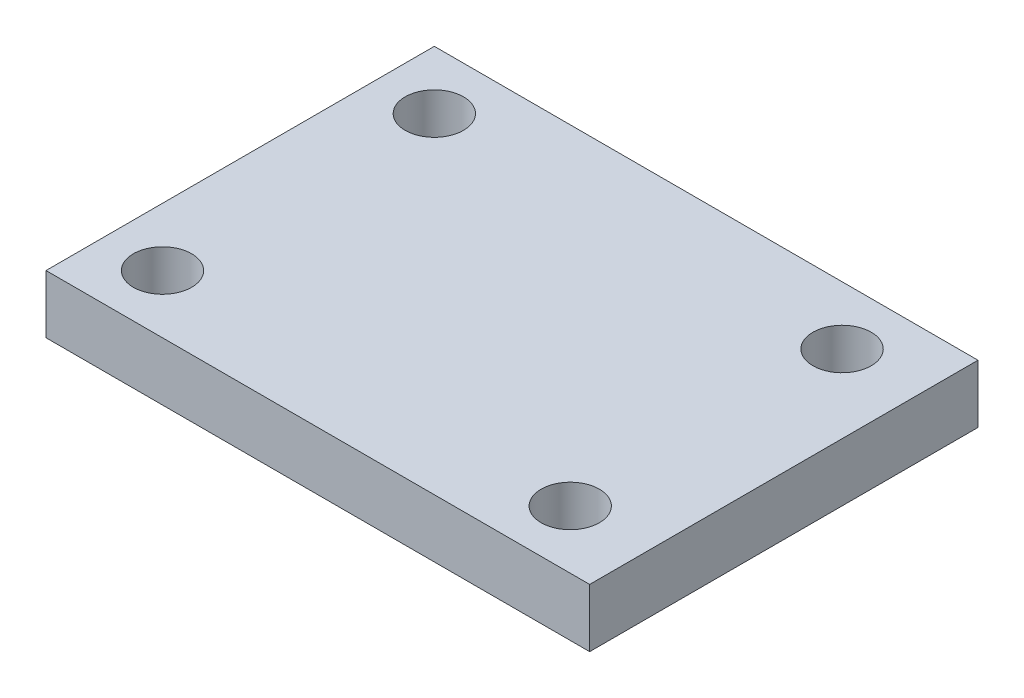
ISO-10303-21;
HEADER;
FILE_DESCRIPTION(('STEP AP214'),'2;1');
FILE_NAME('part.step','',(''),(''),'','','');
FILE_SCHEMA(('AUTOMOTIVE_DESIGN { 1 0 10303 214 1 1 1 1 }'));
ENDSEC;
DATA;
#1=APPLICATION_CONTEXT('core data for automotive mechanical design processes');
#2=APPLICATION_PROTOCOL_DEFINITION('international standard','automotive_design',2000,#1);
#3=PRODUCT_CONTEXT('',#1,'mechanical');
#4=PRODUCT('Part','Part','',(#3));
#5=PRODUCT_RELATED_PRODUCT_CATEGORY('part','',(#4));
#6=PRODUCT_DEFINITION_FORMATION('','',#4);
#7=PRODUCT_DEFINITION_CONTEXT('part definition',#1,'design');
#8=PRODUCT_DEFINITION('design','',#6,#7);
#9=PRODUCT_DEFINITION_SHAPE('','',#8);
#10=(LENGTH_UNIT() NAMED_UNIT(*) SI_UNIT(.MILLI.,.METRE.));
#11=(NAMED_UNIT(*) PLANE_ANGLE_UNIT() SI_UNIT($,.RADIAN.));
#12=(NAMED_UNIT(*) SI_UNIT($,.STERADIAN.) SOLID_ANGLE_UNIT());
#13=UNCERTAINTY_MEASURE_WITH_UNIT(LENGTH_MEASURE(1.E-05),#10,'distance_accuracy_value','');
#14=(GEOMETRIC_REPRESENTATION_CONTEXT(3) GLOBAL_UNCERTAINTY_ASSIGNED_CONTEXT((#13)) GLOBAL_UNIT_ASSIGNED_CONTEXT((#10,
#11,#12)) REPRESENTATION_CONTEXT('',''));
#15=CARTESIAN_POINT('',(0.,0.,0.));
#16=DIRECTION('',(0.,0.,1.));
#17=DIRECTION('',(1.,0.,0.));
#18=AXIS2_PLACEMENT_3D('',#15,#16,#17);
#19=CARTESIAN_POINT('',(-14.,3.,10.));
#20=DIRECTION('',(1.,0.,0.));
#21=DIRECTION('',(0.,0.,-1.));
#22=AXIS2_PLACEMENT_3D('',#19,#20,#21);
#23=PLANE('',#22);
#24=DIRECTION('',(0.,0.,1.));
#25=VECTOR('',#24,1.);
#26=CARTESIAN_POINT('',(-14.,0.,10.));
#27=LINE('',#26,#25);
#28=CARTESIAN_POINT('',(-14.,0.,-10.));
#29=VERTEX_POINT('',#28);
#30=CARTESIAN_POINT('',(-14.,0.,10.));
#31=VERTEX_POINT('',#30);
#32=EDGE_CURVE('E104',#29,#31,#27,.T.);
#33=ORIENTED_EDGE('',*,*,#32,.T.);
#34=DIRECTION('',(0.,-1.,0.));
#35=VECTOR('',#34,1.);
#36=CARTESIAN_POINT('',(-14.,3.,10.));
#37=LINE('',#36,#35);
#38=CARTESIAN_POINT('',(-14.,3.,10.));
#39=VERTEX_POINT('',#38);
#40=EDGE_CURVE('E11',#39,#31,#37,.T.);
#41=ORIENTED_EDGE('',*,*,#40,.F.);
#42=DIRECTION('',(0.,0.,1.));
#43=VECTOR('',#42,1.);
#44=CARTESIAN_POINT('',(-14.,3.,10.));
#45=LINE('',#44,#43);
#46=CARTESIAN_POINT('',(-14.,3.,-10.));
#47=VERTEX_POINT('',#46);
#48=EDGE_CURVE('E92',#47,#39,#45,.T.);
#49=ORIENTED_EDGE('',*,*,#48,.F.);
#50=DIRECTION('',(0.,-1.,0.));
#51=VECTOR('',#50,1.);
#52=CARTESIAN_POINT('',(-14.,3.,-10.));
#53=LINE('',#52,#51);
#54=EDGE_CURVE('E100',#47,#29,#53,.T.);
#55=ORIENTED_EDGE('',*,*,#54,.T.);
#56=EDGE_LOOP('',(#33,#41,#49,#55));
#57=FACE_BOUND('',#56,.T.);
#58=ADVANCED_FACE('F41',(#57),#23,.F.);
#59=CARTESIAN_POINT('',(14.,3.,10.));
#60=DIRECTION('',(0.,0.,-1.));
#61=DIRECTION('',(-1.,0.,0.));
#62=AXIS2_PLACEMENT_3D('',#59,#60,#61);
#63=PLANE('',#62);
#64=DIRECTION('',(1.,0.,0.));
#65=VECTOR('',#64,1.);
#66=CARTESIAN_POINT('',(14.,0.,10.));
#67=LINE('',#66,#65);
#68=CARTESIAN_POINT('',(14.,0.,10.));
#69=VERTEX_POINT('',#68);
#70=EDGE_CURVE('E96',#31,#69,#67,.T.);
#71=ORIENTED_EDGE('',*,*,#70,.T.);
#72=DIRECTION('',(0.,-1.,0.));
#73=VECTOR('',#72,1.);
#74=CARTESIAN_POINT('',(14.,3.,10.));
#75=LINE('',#74,#73);
#76=CARTESIAN_POINT('',(14.,3.,10.));
#77=VERTEX_POINT('',#76);
#78=EDGE_CURVE('E49',#77,#69,#75,.T.);
#79=ORIENTED_EDGE('',*,*,#78,.F.);
#80=DIRECTION('',(1.,0.,0.));
#81=VECTOR('',#80,1.);
#82=CARTESIAN_POINT('',(14.,3.,10.));
#83=LINE('',#82,#81);
#84=EDGE_CURVE('E87',#39,#77,#83,.T.);
#85=ORIENTED_EDGE('',*,*,#84,.F.);
#86=ORIENTED_EDGE('',*,*,#40,.T.);
#87=EDGE_LOOP('',(#71,#79,#85,#86));
#88=FACE_BOUND('',#87,.T.);
#89=ADVANCED_FACE('F95',(#88),#63,.F.);
#90=CARTESIAN_POINT('',(14.,3.,10.));
#91=DIRECTION('',(-1.,0.,0.));
#92=DIRECTION('',(0.,0.,1.));
#93=AXIS2_PLACEMENT_3D('',#90,#91,#92);
#94=PLANE('',#93);
#95=DIRECTION('',(0.,0.,-1.));
#96=VECTOR('',#95,1.);
#97=CARTESIAN_POINT('',(14.,0.,10.));
#98=LINE('',#97,#96);
#99=CARTESIAN_POINT('',(14.,0.,-10.));
#100=VERTEX_POINT('',#99);
#101=EDGE_CURVE('E74',#69,#100,#98,.T.);
#102=ORIENTED_EDGE('',*,*,#101,.T.);
#103=DIRECTION('',(0.,-1.,0.));
#104=VECTOR('',#103,1.);
#105=CARTESIAN_POINT('',(14.,3.,-10.));
#106=LINE('',#105,#104);
#107=CARTESIAN_POINT('',(14.,3.,-10.));
#108=VERTEX_POINT('',#107);
#109=EDGE_CURVE('E97',#108,#100,#106,.T.);
#110=ORIENTED_EDGE('',*,*,#109,.F.);
#111=DIRECTION('',(0.,0.,-1.));
#112=VECTOR('',#111,1.);
#113=CARTESIAN_POINT('',(14.,3.,10.));
#114=LINE('',#113,#112);
#115=EDGE_CURVE('E90',#77,#108,#114,.T.);
#116=ORIENTED_EDGE('',*,*,#115,.F.);
#117=ORIENTED_EDGE('',*,*,#78,.T.);
#118=EDGE_LOOP('',(#102,#110,#116,#117));
#119=FACE_BOUND('',#118,.T.);
#120=ADVANCED_FACE('F98',(#119),#94,.F.);
#121=CARTESIAN_POINT('',(14.,3.,-10.));
#122=DIRECTION('',(0.,0.,1.));
#123=DIRECTION('',(1.,0.,0.));
#124=AXIS2_PLACEMENT_3D('',#121,#122,#123);
#125=PLANE('',#124);
#126=DIRECTION('',(-1.,0.,0.));
#127=VECTOR('',#126,1.);
#128=CARTESIAN_POINT('',(14.,0.,-10.));
#129=LINE('',#128,#127);
#130=EDGE_CURVE('E80',#100,#29,#129,.T.);
#131=ORIENTED_EDGE('',*,*,#130,.T.);
#132=ORIENTED_EDGE('',*,*,#54,.F.);
#133=DIRECTION('',(-1.,0.,0.));
#134=VECTOR('',#133,1.);
#135=CARTESIAN_POINT('',(14.,3.,-10.));
#136=LINE('',#135,#134);
#137=EDGE_CURVE('E57',#108,#47,#136,.T.);
#138=ORIENTED_EDGE('',*,*,#137,.F.);
#139=ORIENTED_EDGE('',*,*,#109,.T.);
#140=EDGE_LOOP('',(#131,#132,#138,#139));
#141=FACE_BOUND('',#140,.T.);
#142=ADVANCED_FACE('F112',(#141),#125,.F.);
#143=CARTESIAN_POINT('',(0.,3.,0.));
#144=DIRECTION('',(0.,1.,0.));
#145=DIRECTION('',(0.,0.,1.));
#146=AXIS2_PLACEMENT_3D('',#143,#144,#145);
#147=PLANE('',#146);
#148=CARTESIAN_POINT('',(-11.,3.,-7.));
#149=DIRECTION('',(0.,1.,0.));
#150=DIRECTION('',(0.,0.,1.));
#151=AXIS2_PLACEMENT_3D('',#148,#149,#150);
#152=CIRCLE('',#151,1.49999999999999);
#153=CARTESIAN_POINT('',(-11.,3.,-5.50000000000001));
#154=VERTEX_POINT('',#153);
#155=EDGE_CURVE('E138',#154,#154,#152,.T.);
#156=ORIENTED_EDGE('',*,*,#155,.F.);
#157=EDGE_LOOP('',(#156));
#158=FACE_BOUND('',#157,.T.);
#159=CARTESIAN_POINT('',(-11.,3.,7.));
#160=DIRECTION('',(0.,1.,0.));
#161=DIRECTION('',(0.,0.,1.));
#162=AXIS2_PLACEMENT_3D('',#159,#160,#161);
#163=CIRCLE('',#162,1.49999999999999);
#164=CARTESIAN_POINT('',(-11.,3.,8.49999999999999));
#165=VERTEX_POINT('',#164);
#166=EDGE_CURVE('E132',#165,#165,#163,.T.);
#167=ORIENTED_EDGE('',*,*,#166,.F.);
#168=EDGE_LOOP('',(#167));
#169=FACE_BOUND('',#168,.T.);
#170=CARTESIAN_POINT('',(10.,3.,7.));
#171=DIRECTION('',(0.,1.,0.));
#172=DIRECTION('',(0.,0.,1.));
#173=AXIS2_PLACEMENT_3D('',#170,#171,#172);
#174=CIRCLE('',#173,1.49999999999999);
#175=CARTESIAN_POINT('',(10.,3.,8.49999999999999));
#176=VERTEX_POINT('',#175);
#177=EDGE_CURVE('E126',#176,#176,#174,.T.);
#178=ORIENTED_EDGE('',*,*,#177,.F.);
#179=EDGE_LOOP('',(#178));
#180=FACE_BOUND('',#179,.T.);
#181=CARTESIAN_POINT('',(10.,3.,-7.));
#182=DIRECTION('',(0.,1.,0.));
#183=DIRECTION('',(0.,0.,1.));
#184=AXIS2_PLACEMENT_3D('',#181,#182,#183);
#185=CIRCLE('',#184,1.49999999999999);
#186=CARTESIAN_POINT('',(10.,3.,-5.50000000000001));
#187=VERTEX_POINT('',#186);
#188=EDGE_CURVE('E120',#187,#187,#185,.T.);
#189=ORIENTED_EDGE('',*,*,#188,.F.);
#190=EDGE_LOOP('',(#189));
#191=FACE_BOUND('',#190,.T.);
#192=ORIENTED_EDGE('',*,*,#48,.T.);
#193=ORIENTED_EDGE('',*,*,#84,.T.);
#194=ORIENTED_EDGE('',*,*,#115,.T.);
#195=ORIENTED_EDGE('',*,*,#137,.T.);
#196=EDGE_LOOP('',(#192,#193,#194,#195));
#197=FACE_BOUND('',#196,.T.);
#198=ADVANCED_FACE('F88',(#158,#169,#180,#191,#197),#147,.T.);
#199=CARTESIAN_POINT('',(0.,0.,0.));
#200=DIRECTION('',(0.,1.,0.));
#201=DIRECTION('',(0.,0.,1.));
#202=AXIS2_PLACEMENT_3D('',#199,#200,#201);
#203=PLANE('',#202);
#204=CARTESIAN_POINT('',(-11.,0.,-7.));
#205=DIRECTION('',(0.,1.,0.));
#206=DIRECTION('',(0.,0.,1.));
#207=AXIS2_PLACEMENT_3D('',#204,#205,#206);
#208=CIRCLE('',#207,1.5);
#209=CARTESIAN_POINT('',(-11.,0.,-5.5));
#210=VERTEX_POINT('',#209);
#211=EDGE_CURVE('E135',#210,#210,#208,.T.);
#212=ORIENTED_EDGE('',*,*,#211,.T.);
#213=EDGE_LOOP('',(#212));
#214=FACE_BOUND('',#213,.T.);
#215=CARTESIAN_POINT('',(-11.,0.,7.));
#216=DIRECTION('',(0.,1.,0.));
#217=DIRECTION('',(0.,0.,1.));
#218=AXIS2_PLACEMENT_3D('',#215,#216,#217);
#219=CIRCLE('',#218,1.5);
#220=CARTESIAN_POINT('',(-11.,0.,8.5));
#221=VERTEX_POINT('',#220);
#222=EDGE_CURVE('E129',#221,#221,#219,.T.);
#223=ORIENTED_EDGE('',*,*,#222,.T.);
#224=EDGE_LOOP('',(#223));
#225=FACE_BOUND('',#224,.T.);
#226=CARTESIAN_POINT('',(10.,0.,7.));
#227=DIRECTION('',(0.,1.,0.));
#228=DIRECTION('',(0.,0.,1.));
#229=AXIS2_PLACEMENT_3D('',#226,#227,#228);
#230=CIRCLE('',#229,1.5);
#231=CARTESIAN_POINT('',(10.,0.,8.5));
#232=VERTEX_POINT('',#231);
#233=EDGE_CURVE('E123',#232,#232,#230,.T.);
#234=ORIENTED_EDGE('',*,*,#233,.T.);
#235=EDGE_LOOP('',(#234));
#236=FACE_BOUND('',#235,.T.);
#237=CARTESIAN_POINT('',(10.,0.,-7.));
#238=DIRECTION('',(0.,1.,0.));
#239=DIRECTION('',(0.,0.,1.));
#240=AXIS2_PLACEMENT_3D('',#237,#238,#239);
#241=CIRCLE('',#240,1.5);
#242=CARTESIAN_POINT('',(10.,0.,-5.5));
#243=VERTEX_POINT('',#242);
#244=EDGE_CURVE('E107',#243,#243,#241,.T.);
#245=ORIENTED_EDGE('',*,*,#244,.T.);
#246=EDGE_LOOP('',(#245));
#247=FACE_BOUND('',#246,.T.);
#248=ORIENTED_EDGE('',*,*,#32,.F.);
#249=ORIENTED_EDGE('',*,*,#130,.F.);
#250=ORIENTED_EDGE('',*,*,#101,.F.);
#251=ORIENTED_EDGE('',*,*,#70,.F.);
#252=EDGE_LOOP('',(#248,#249,#250,#251));
#253=FACE_BOUND('',#252,.T.);
#254=ADVANCED_FACE('F115',(#214,#225,#236,#247,#253),#203,.F.);
#255=CARTESIAN_POINT('',(10.,3.,-7.));
#256=DIRECTION('',(0.,1.,0.));
#257=DIRECTION('',(0.,0.,1.));
#258=AXIS2_PLACEMENT_3D('',#255,#256,#257);
#259=CYLINDRICAL_SURFACE('',#258,1.49999999999999);
#260=ORIENTED_EDGE('',*,*,#244,.F.);
#261=EDGE_LOOP('',(#260));
#262=FACE_BOUND('',#261,.T.);
#263=ORIENTED_EDGE('',*,*,#188,.T.);
#264=EDGE_LOOP('',(#263));
#265=FACE_BOUND('',#264,.T.);
#266=ADVANCED_FACE('F153',(#262,#265),#259,.F.);
#267=CARTESIAN_POINT('',(10.,3.,7.));
#268=DIRECTION('',(0.,1.,0.));
#269=DIRECTION('',(0.,0.,1.));
#270=AXIS2_PLACEMENT_3D('',#267,#268,#269);
#271=CYLINDRICAL_SURFACE('',#270,1.49999999999999);
#272=ORIENTED_EDGE('',*,*,#233,.F.);
#273=EDGE_LOOP('',(#272));
#274=FACE_BOUND('',#273,.T.);
#275=ORIENTED_EDGE('',*,*,#177,.T.);
#276=EDGE_LOOP('',(#275));
#277=FACE_BOUND('',#276,.T.);
#278=ADVANCED_FACE('F155',(#274,#277),#271,.F.);
#279=CARTESIAN_POINT('',(-11.,3.,7.));
#280=DIRECTION('',(0.,1.,0.));
#281=DIRECTION('',(0.,0.,1.));
#282=AXIS2_PLACEMENT_3D('',#279,#280,#281);
#283=CYLINDRICAL_SURFACE('',#282,1.49999999999999);
#284=ORIENTED_EDGE('',*,*,#222,.F.);
#285=EDGE_LOOP('',(#284));
#286=FACE_BOUND('',#285,.T.);
#287=ORIENTED_EDGE('',*,*,#166,.T.);
#288=EDGE_LOOP('',(#287));
#289=FACE_BOUND('',#288,.T.);
#290=ADVANCED_FACE('F162',(#286,#289),#283,.F.);
#291=CARTESIAN_POINT('',(-11.,3.,-7.));
#292=DIRECTION('',(0.,1.,0.));
#293=DIRECTION('',(0.,0.,1.));
#294=AXIS2_PLACEMENT_3D('',#291,#292,#293);
#295=CYLINDRICAL_SURFACE('',#294,1.49999999999999);
#296=ORIENTED_EDGE('',*,*,#211,.F.);
#297=EDGE_LOOP('',(#296));
#298=FACE_BOUND('',#297,.T.);
#299=ORIENTED_EDGE('',*,*,#155,.T.);
#300=EDGE_LOOP('',(#299));
#301=FACE_BOUND('',#300,.T.);
#302=ADVANCED_FACE('F142',(#298,#301),#295,.F.);
#303=CLOSED_SHELL('',(#58,#89,#120,#142,#198,#254,#266,#278,#290,#302));
#304=MANIFOLD_SOLID_BREP('B2',#303);
#305=ADVANCED_BREP_SHAPE_REPRESENTATION('',(#18,#304),#14);
#306=SHAPE_DEFINITION_REPRESENTATION(#9,#305);
ENDSEC;
END-ISO-10303-21;
